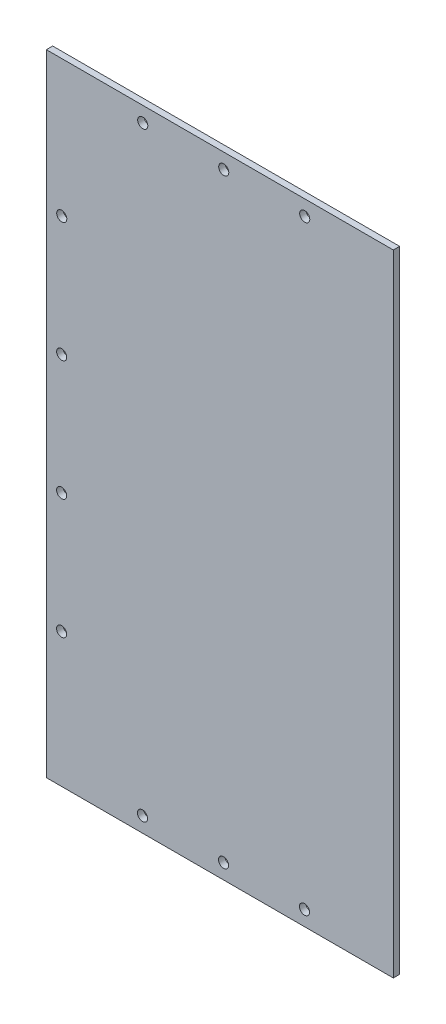
ISO-10303-21;
HEADER;
FILE_DESCRIPTION(('STEP AP214'),'2;1');
FILE_NAME('part.step','',(''),(''),'','','');
FILE_SCHEMA(('AUTOMOTIVE_DESIGN { 1 0 10303 214 1 1 1 1 }'));
ENDSEC;
DATA;
#1=APPLICATION_CONTEXT('core data for automotive mechanical design processes');
#2=APPLICATION_PROTOCOL_DEFINITION('international standard','automotive_design',2000,#1);
#3=PRODUCT_CONTEXT('',#1,'mechanical');
#4=PRODUCT('Part','Part','',(#3));
#5=PRODUCT_RELATED_PRODUCT_CATEGORY('part','',(#4));
#6=PRODUCT_DEFINITION_FORMATION('','',#4);
#7=PRODUCT_DEFINITION_CONTEXT('part definition',#1,'design');
#8=PRODUCT_DEFINITION('design','',#6,#7);
#9=PRODUCT_DEFINITION_SHAPE('','',#8);
#10=(LENGTH_UNIT() NAMED_UNIT(*) SI_UNIT(.MILLI.,.METRE.));
#11=(NAMED_UNIT(*) PLANE_ANGLE_UNIT() SI_UNIT($,.RADIAN.));
#12=(NAMED_UNIT(*) SI_UNIT($,.STERADIAN.) SOLID_ANGLE_UNIT());
#13=UNCERTAINTY_MEASURE_WITH_UNIT(LENGTH_MEASURE(1.E-05),#10,'distance_accuracy_value','');
#14=(GEOMETRIC_REPRESENTATION_CONTEXT(3) GLOBAL_UNCERTAINTY_ASSIGNED_CONTEXT((#13)) GLOBAL_UNIT_ASSIGNED_CONTEXT((#10,
#11,#12)) REPRESENTATION_CONTEXT('',''));
#15=CARTESIAN_POINT('',(0.,0.,0.));
#16=DIRECTION('',(0.,0.,1.));
#17=DIRECTION('',(1.,0.,0.));
#18=AXIS2_PLACEMENT_3D('',#15,#16,#17);
#19=CARTESIAN_POINT('',(-228.841848041994,-444.850958250123,5.));
#20=DIRECTION('',(1.,0.,0.));
#21=DIRECTION('',(0.,0.,-1.));
#22=AXIS2_PLACEMENT_3D('',#19,#20,#21);
#23=PLANE('',#22);
#24=DIRECTION('',(0.,-1.,0.));
#25=VECTOR('',#24,1.);
#26=CARTESIAN_POINT('',(-228.841848041994,-444.850958250123,0.));
#27=LINE('',#26,#25);
#28=CARTESIAN_POINT('',(-228.841848041994,53.4962366274568,0.));
#29=VERTEX_POINT('',#28);
#30=CARTESIAN_POINT('',(-228.841848041994,-444.850958250123,0.));
#31=VERTEX_POINT('',#30);
#32=EDGE_CURVE('E99',#29,#31,#27,.T.);
#33=ORIENTED_EDGE('',*,*,#32,.T.);
#34=DIRECTION('',(0.,0.,-1.));
#35=VECTOR('',#34,1.);
#36=CARTESIAN_POINT('',(-228.841848041994,-444.850958250123,5.));
#37=LINE('',#36,#35);
#38=CARTESIAN_POINT('',(-228.841848041994,-444.850958250123,5.));
#39=VERTEX_POINT('',#38);
#40=EDGE_CURVE('E11',#39,#31,#37,.T.);
#41=ORIENTED_EDGE('',*,*,#40,.F.);
#42=DIRECTION('',(0.,-1.,0.));
#43=VECTOR('',#42,1.);
#44=CARTESIAN_POINT('',(-228.841848041994,-444.850958250123,5.));
#45=LINE('',#44,#43);
#46=CARTESIAN_POINT('',(-228.841848041994,53.4962366274568,5.));
#47=VERTEX_POINT('',#46);
#48=EDGE_CURVE('E87',#47,#39,#45,.T.);
#49=ORIENTED_EDGE('',*,*,#48,.F.);
#50=DIRECTION('',(0.,0.,-1.));
#51=VECTOR('',#50,1.);
#52=CARTESIAN_POINT('',(-228.841848041994,53.4962366274568,5.));
#53=LINE('',#52,#51);
#54=EDGE_CURVE('E95',#47,#29,#53,.T.);
#55=ORIENTED_EDGE('',*,*,#54,.T.);
#56=EDGE_LOOP('',(#33,#41,#49,#55));
#57=FACE_BOUND('',#56,.T.);
#58=ADVANCED_FACE('F36',(#57),#23,.F.);
#59=CARTESIAN_POINT('',(-228.841848041994,-444.850958250123,5.));
#60=DIRECTION('',(0.,1.,0.));
#61=DIRECTION('',(0.,0.,1.));
#62=AXIS2_PLACEMENT_3D('',#59,#60,#61);
#63=PLANE('',#62);
#64=DIRECTION('',(1.,0.,0.));
#65=VECTOR('',#64,1.);
#66=CARTESIAN_POINT('',(-228.841848041994,-444.850958250123,0.));
#67=LINE('',#66,#65);
#68=CARTESIAN_POINT('',(45.421551958008,-444.850958250123,0.));
#69=VERTEX_POINT('',#68);
#70=EDGE_CURVE('E91',#31,#69,#67,.T.);
#71=ORIENTED_EDGE('',*,*,#70,.T.);
#72=DIRECTION('',(0.,0.,-1.));
#73=VECTOR('',#72,1.);
#74=CARTESIAN_POINT('',(45.421551958008,-444.850958250123,5.));
#75=LINE('',#74,#73);
#76=CARTESIAN_POINT('',(45.421551958008,-444.850958250123,5.));
#77=VERTEX_POINT('',#76);
#78=EDGE_CURVE('E44',#77,#69,#75,.T.);
#79=ORIENTED_EDGE('',*,*,#78,.F.);
#80=DIRECTION('',(1.,0.,0.));
#81=VECTOR('',#80,1.);
#82=CARTESIAN_POINT('',(-228.841848041994,-444.850958250123,5.));
#83=LINE('',#82,#81);
#84=EDGE_CURVE('E82',#39,#77,#83,.T.);
#85=ORIENTED_EDGE('',*,*,#84,.F.);
#86=ORIENTED_EDGE('',*,*,#40,.T.);
#87=EDGE_LOOP('',(#71,#79,#85,#86));
#88=FACE_BOUND('',#87,.T.);
#89=ADVANCED_FACE('F90',(#88),#63,.F.);
#90=CARTESIAN_POINT('',(45.4215519580079,53.4962366274568,5.));
#91=DIRECTION('',(-1.,0.,0.));
#92=DIRECTION('',(0.,-1.,0.));
#93=AXIS2_PLACEMENT_3D('',#90,#91,#92);
#94=PLANE('',#93);
#95=DIRECTION('',(0.,1.,0.));
#96=VECTOR('',#95,1.);
#97=CARTESIAN_POINT('',(45.4215519580079,53.4962366274568,0.));
#98=LINE('',#97,#96);
#99=CARTESIAN_POINT('',(45.4215519580079,53.4962366274568,0.));
#100=VERTEX_POINT('',#99);
#101=EDGE_CURVE('E69',#69,#100,#98,.T.);
#102=ORIENTED_EDGE('',*,*,#101,.T.);
#103=DIRECTION('',(0.,0.,-1.));
#104=VECTOR('',#103,1.);
#105=CARTESIAN_POINT('',(45.4215519580079,53.4962366274568,5.));
#106=LINE('',#105,#104);
#107=CARTESIAN_POINT('',(45.4215519580079,53.4962366274568,5.));
#108=VERTEX_POINT('',#107);
#109=EDGE_CURVE('E92',#108,#100,#106,.T.);
#110=ORIENTED_EDGE('',*,*,#109,.F.);
#111=DIRECTION('',(0.,1.,0.));
#112=VECTOR('',#111,1.);
#113=CARTESIAN_POINT('',(45.4215519580079,53.4962366274568,5.));
#114=LINE('',#113,#112);
#115=EDGE_CURVE('E85',#77,#108,#114,.T.);
#116=ORIENTED_EDGE('',*,*,#115,.F.);
#117=ORIENTED_EDGE('',*,*,#78,.T.);
#118=EDGE_LOOP('',(#102,#110,#116,#117));
#119=FACE_BOUND('',#118,.T.);
#120=ADVANCED_FACE('F93',(#119),#94,.F.);
#121=CARTESIAN_POINT('',(-228.841848041994,53.4962366274568,5.));
#122=DIRECTION('',(0.,-1.,0.));
#123=DIRECTION('',(1.,0.,0.));
#124=AXIS2_PLACEMENT_3D('',#121,#122,#123);
#125=PLANE('',#124);
#126=DIRECTION('',(-1.,0.,0.));
#127=VECTOR('',#126,1.);
#128=CARTESIAN_POINT('',(-228.841848041994,53.4962366274568,0.));
#129=LINE('',#128,#127);
#130=EDGE_CURVE('E75',#100,#29,#129,.T.);
#131=ORIENTED_EDGE('',*,*,#130,.T.);
#132=ORIENTED_EDGE('',*,*,#54,.F.);
#133=DIRECTION('',(-1.,0.,0.));
#134=VECTOR('',#133,1.);
#135=CARTESIAN_POINT('',(-228.841848041994,53.4962366274568,5.));
#136=LINE('',#135,#134);
#137=EDGE_CURVE('E52',#108,#47,#136,.T.);
#138=ORIENTED_EDGE('',*,*,#137,.F.);
#139=ORIENTED_EDGE('',*,*,#109,.T.);
#140=EDGE_LOOP('',(#131,#132,#138,#139));
#141=FACE_BOUND('',#140,.T.);
#142=ADVANCED_FACE('F107',(#141),#125,.F.);
#143=CARTESIAN_POINT('',(0.,0.,5.));
#144=DIRECTION('',(0.,0.,-1.));
#145=DIRECTION('',(-1.,0.,0.));
#146=AXIS2_PLACEMENT_3D('',#143,#144,#145);
#147=PLANE('',#146);
#148=CARTESIAN_POINT('',(-88.6292429195729,41.4712366274558,5.));
#149=DIRECTION('',(0.,0.,-1.));
#150=DIRECTION('',(-1.,0.,0.));
#151=AXIS2_PLACEMENT_3D('',#148,#149,#150);
#152=CIRCLE('',#151,3.99999999999999);
#153=CARTESIAN_POINT('',(-92.6292429195729,41.4712366274558,5.));
#154=VERTEX_POINT('',#153);
#155=EDGE_CURVE('E118',#154,#154,#152,.F.);
#156=ORIENTED_EDGE('',*,*,#155,.F.);
#157=EDGE_LOOP('',(#156));
#158=FACE_BOUND('',#157,.T.);
#159=CARTESIAN_POINT('',(-24.6212429195729,41.4712366274558,5.));
#160=DIRECTION('',(0.,0.,-1.));
#161=DIRECTION('',(-1.,0.,0.));
#162=AXIS2_PLACEMENT_3D('',#159,#160,#161);
#163=CIRCLE('',#162,4.00000000000001);
#164=CARTESIAN_POINT('',(-28.6212429195729,41.4712366274558,5.));
#165=VERTEX_POINT('',#164);
#166=EDGE_CURVE('E157',#165,#165,#163,.F.);
#167=ORIENTED_EDGE('',*,*,#166,.F.);
#168=EDGE_LOOP('',(#167));
#169=FACE_BOUND('',#168,.T.);
#170=CARTESIAN_POINT('',(-216.673520112257,-54.3287633725442,5.));
#171=DIRECTION('',(0.,0.,-1.));
#172=DIRECTION('',(-1.,0.,0.));
#173=AXIS2_PLACEMENT_3D('',#170,#171,#172);
#174=CIRCLE('',#173,4.00000000000002);
#175=CARTESIAN_POINT('',(-220.673520112257,-54.3287633725442,5.));
#176=VERTEX_POINT('',#175);
#177=EDGE_CURVE('E151',#176,#176,#174,.F.);
#178=ORIENTED_EDGE('',*,*,#177,.F.);
#179=EDGE_LOOP('',(#178));
#180=FACE_BOUND('',#179,.T.);
#181=CARTESIAN_POINT('',(-216.70939666538,-149.070763372544,5.));
#182=DIRECTION('',(0.,0.,-1.));
#183=DIRECTION('',(-1.,0.,0.));
#184=AXIS2_PLACEMENT_3D('',#181,#182,#183);
#185=CIRCLE('',#184,3.99999999999999);
#186=CARTESIAN_POINT('',(-220.70939666538,-149.070763372544,5.));
#187=VERTEX_POINT('',#186);
#188=EDGE_CURVE('E145',#187,#187,#185,.F.);
#189=ORIENTED_EDGE('',*,*,#188,.F.);
#190=EDGE_LOOP('',(#189));
#191=FACE_BOUND('',#190,.T.);
#192=CARTESIAN_POINT('',(-216.745295181731,-243.870763372544,5.));
#193=DIRECTION('',(0.,0.,-1.));
#194=DIRECTION('',(-1.,0.,0.));
#195=AXIS2_PLACEMENT_3D('',#192,#193,#194);
#196=CIRCLE('',#195,3.99999999999999);
#197=CARTESIAN_POINT('',(-220.745295181731,-243.870763372544,5.));
#198=VERTEX_POINT('',#197);
#199=EDGE_CURVE('E139',#198,#198,#196,.F.);
#200=ORIENTED_EDGE('',*,*,#199,.F.);
#201=EDGE_LOOP('',(#200));
#202=FACE_BOUND('',#201,.T.);
#203=CARTESIAN_POINT('',(-216.781193698083,-338.670763372544,5.));
#204=DIRECTION('',(0.,0.,-1.));
#205=DIRECTION('',(-1.,0.,0.));
#206=AXIS2_PLACEMENT_3D('',#203,#204,#205);
#207=CIRCLE('',#206,4.00000000000002);
#208=CARTESIAN_POINT('',(-220.781193698083,-338.670763372544,5.));
#209=VERTEX_POINT('',#208);
#210=EDGE_CURVE('E133',#209,#209,#207,.F.);
#211=ORIENTED_EDGE('',*,*,#210,.F.);
#212=EDGE_LOOP('',(#211));
#213=FACE_BOUND('',#212,.T.);
#214=CARTESIAN_POINT('',(-152.808848041994,-432.870680177189,5.));
#215=DIRECTION('',(0.,0.,-1.));
#216=DIRECTION('',(-1.,0.,0.));
#217=AXIS2_PLACEMENT_3D('',#214,#215,#216);
#218=CIRCLE('',#217,3.99999999999999);
#219=CARTESIAN_POINT('',(-156.808848041994,-432.870680177189,5.));
#220=VERTEX_POINT('',#219);
#221=EDGE_CURVE('E127',#220,#220,#218,.F.);
#222=ORIENTED_EDGE('',*,*,#221,.F.);
#223=EDGE_LOOP('',(#222));
#224=FACE_BOUND('',#223,.T.);
#225=CARTESIAN_POINT('',(-88.8008480419944,-432.915402104254,5.));
#226=DIRECTION('',(0.,0.,-1.));
#227=DIRECTION('',(-1.,0.,0.));
#228=AXIS2_PLACEMENT_3D('',#225,#226,#227);
#229=CIRCLE('',#228,4.00000000000003);
#230=CARTESIAN_POINT('',(-92.8008480419944,-432.915402104254,5.));
#231=VERTEX_POINT('',#230);
#232=EDGE_CURVE('E119',#231,#231,#229,.F.);
#233=ORIENTED_EDGE('',*,*,#232,.F.);
#234=EDGE_LOOP('',(#233));
#235=FACE_BOUND('',#234,.T.);
#236=CARTESIAN_POINT('',(-24.7928480419944,-432.960124031319,5.));
#237=DIRECTION('',(0.,0.,-1.));
#238=DIRECTION('',(-1.,0.,0.));
#239=AXIS2_PLACEMENT_3D('',#236,#237,#238);
#240=CIRCLE('',#239,3.99999999999999);
#241=CARTESIAN_POINT('',(-28.7928480419944,-432.960124031319,5.));
#242=VERTEX_POINT('',#241);
#243=EDGE_CURVE('E126',#242,#242,#240,.F.);
#244=ORIENTED_EDGE('',*,*,#243,.F.);
#245=EDGE_LOOP('',(#244));
#246=FACE_BOUND('',#245,.T.);
#247=CARTESIAN_POINT('',(-152.637242919573,41.4712366274558,5.));
#248=DIRECTION('',(0.,0.,-1.));
#249=DIRECTION('',(-1.,0.,0.));
#250=AXIS2_PLACEMENT_3D('',#247,#248,#249);
#251=CIRCLE('',#250,3.99999999999999);
#252=CARTESIAN_POINT('',(-156.637242919573,41.4712366274558,5.));
#253=VERTEX_POINT('',#252);
#254=EDGE_CURVE('E102',#253,#253,#251,.F.);
#255=ORIENTED_EDGE('',*,*,#254,.F.);
#256=EDGE_LOOP('',(#255));
#257=FACE_BOUND('',#256,.T.);
#258=ORIENTED_EDGE('',*,*,#48,.T.);
#259=ORIENTED_EDGE('',*,*,#84,.T.);
#260=ORIENTED_EDGE('',*,*,#115,.T.);
#261=ORIENTED_EDGE('',*,*,#137,.T.);
#262=EDGE_LOOP('',(#258,#259,#260,#261));
#263=FACE_BOUND('',#262,.T.);
#264=ADVANCED_FACE('F83',(#158,#169,#180,#191,#202,#213,#224,#235,#246,#257,#263),#147,.F.);
#265=CARTESIAN_POINT('',(0.,0.,0.));
#266=DIRECTION('',(0.,0.,-1.));
#267=DIRECTION('',(-1.,0.,0.));
#268=AXIS2_PLACEMENT_3D('',#265,#266,#267);
#269=PLANE('',#268);
#270=CARTESIAN_POINT('',(-88.6292429195729,41.4712366274558,0.));
#271=DIRECTION('',(0.,0.,-1.));
#272=DIRECTION('',(-1.,0.,0.));
#273=AXIS2_PLACEMENT_3D('',#270,#271,#272);
#274=CIRCLE('',#273,3.99999999999999);
#275=CARTESIAN_POINT('',(-92.6292429195729,41.4712366274558,0.));
#276=VERTEX_POINT('',#275);
#277=EDGE_CURVE('E160',#276,#276,#274,.T.);
#278=ORIENTED_EDGE('',*,*,#277,.F.);
#279=EDGE_LOOP('',(#278));
#280=FACE_BOUND('',#279,.T.);
#281=CARTESIAN_POINT('',(-24.6212429195729,41.4712366274558,0.));
#282=DIRECTION('',(0.,0.,-1.));
#283=DIRECTION('',(-1.,0.,0.));
#284=AXIS2_PLACEMENT_3D('',#281,#282,#283);
#285=CIRCLE('',#284,4.00000000000001);
#286=CARTESIAN_POINT('',(-28.6212429195729,41.4712366274558,0.));
#287=VERTEX_POINT('',#286);
#288=EDGE_CURVE('E154',#287,#287,#285,.T.);
#289=ORIENTED_EDGE('',*,*,#288,.F.);
#290=EDGE_LOOP('',(#289));
#291=FACE_BOUND('',#290,.T.);
#292=CARTESIAN_POINT('',(-216.673520112257,-54.3287633725442,0.));
#293=DIRECTION('',(0.,0.,-1.));
#294=DIRECTION('',(-1.,0.,0.));
#295=AXIS2_PLACEMENT_3D('',#292,#293,#294);
#296=CIRCLE('',#295,4.00000000000002);
#297=CARTESIAN_POINT('',(-220.673520112257,-54.3287633725442,0.));
#298=VERTEX_POINT('',#297);
#299=EDGE_CURVE('E148',#298,#298,#296,.T.);
#300=ORIENTED_EDGE('',*,*,#299,.F.);
#301=EDGE_LOOP('',(#300));
#302=FACE_BOUND('',#301,.T.);
#303=CARTESIAN_POINT('',(-216.70939666538,-149.070763372544,0.));
#304=DIRECTION('',(0.,0.,-1.));
#305=DIRECTION('',(-1.,0.,0.));
#306=AXIS2_PLACEMENT_3D('',#303,#304,#305);
#307=CIRCLE('',#306,3.99999999999999);
#308=CARTESIAN_POINT('',(-220.70939666538,-149.070763372544,0.));
#309=VERTEX_POINT('',#308);
#310=EDGE_CURVE('E142',#309,#309,#307,.T.);
#311=ORIENTED_EDGE('',*,*,#310,.F.);
#312=EDGE_LOOP('',(#311));
#313=FACE_BOUND('',#312,.T.);
#314=CARTESIAN_POINT('',(-216.745295181731,-243.870763372544,0.));
#315=DIRECTION('',(0.,0.,-1.));
#316=DIRECTION('',(-1.,0.,0.));
#317=AXIS2_PLACEMENT_3D('',#314,#315,#316);
#318=CIRCLE('',#317,3.99999999999999);
#319=CARTESIAN_POINT('',(-220.745295181731,-243.870763372544,0.));
#320=VERTEX_POINT('',#319);
#321=EDGE_CURVE('E136',#320,#320,#318,.T.);
#322=ORIENTED_EDGE('',*,*,#321,.F.);
#323=EDGE_LOOP('',(#322));
#324=FACE_BOUND('',#323,.T.);
#325=CARTESIAN_POINT('',(-216.781193698083,-338.670763372544,0.));
#326=DIRECTION('',(0.,0.,-1.));
#327=DIRECTION('',(-1.,0.,0.));
#328=AXIS2_PLACEMENT_3D('',#325,#326,#327);
#329=CIRCLE('',#328,4.00000000000002);
#330=CARTESIAN_POINT('',(-220.781193698083,-338.670763372544,0.));
#331=VERTEX_POINT('',#330);
#332=EDGE_CURVE('E130',#331,#331,#329,.T.);
#333=ORIENTED_EDGE('',*,*,#332,.F.);
#334=EDGE_LOOP('',(#333));
#335=FACE_BOUND('',#334,.T.);
#336=CARTESIAN_POINT('',(-152.808848041994,-432.870680177189,0.));
#337=DIRECTION('',(0.,0.,-1.));
#338=DIRECTION('',(-1.,0.,0.));
#339=AXIS2_PLACEMENT_3D('',#336,#337,#338);
#340=CIRCLE('',#339,3.99999999999999);
#341=CARTESIAN_POINT('',(-156.808848041994,-432.870680177189,0.));
#342=VERTEX_POINT('',#341);
#343=EDGE_CURVE('E122',#342,#342,#340,.T.);
#344=ORIENTED_EDGE('',*,*,#343,.F.);
#345=EDGE_LOOP('',(#344));
#346=FACE_BOUND('',#345,.T.);
#347=CARTESIAN_POINT('',(-88.8008480419944,-432.915402104254,0.));
#348=DIRECTION('',(0.,0.,-1.));
#349=DIRECTION('',(-1.,0.,0.));
#350=AXIS2_PLACEMENT_3D('',#347,#348,#349);
#351=CIRCLE('',#350,4.00000000000003);
#352=CARTESIAN_POINT('',(-92.8008480419944,-432.915402104254,0.));
#353=VERTEX_POINT('',#352);
#354=EDGE_CURVE('E123',#353,#353,#351,.T.);
#355=ORIENTED_EDGE('',*,*,#354,.F.);
#356=EDGE_LOOP('',(#355));
#357=FACE_BOUND('',#356,.T.);
#358=CARTESIAN_POINT('',(-24.7928480419944,-432.960124031319,0.));
#359=DIRECTION('',(0.,0.,-1.));
#360=DIRECTION('',(-1.,0.,0.));
#361=AXIS2_PLACEMENT_3D('',#358,#359,#360);
#362=CIRCLE('',#361,3.99999999999999);
#363=CARTESIAN_POINT('',(-28.7928480419944,-432.960124031319,0.));
#364=VERTEX_POINT('',#363);
#365=EDGE_CURVE('E169',#364,#364,#362,.T.);
#366=ORIENTED_EDGE('',*,*,#365,.F.);
#367=EDGE_LOOP('',(#366));
#368=FACE_BOUND('',#367,.T.);
#369=CARTESIAN_POINT('',(-152.637242919573,41.4712366274558,0.));
#370=DIRECTION('',(0.,0.,-1.));
#371=DIRECTION('',(-1.,0.,0.));
#372=AXIS2_PLACEMENT_3D('',#369,#370,#371);
#373=CIRCLE('',#372,3.99999999999999);
#374=CARTESIAN_POINT('',(-156.637242919573,41.4712366274558,0.));
#375=VERTEX_POINT('',#374);
#376=EDGE_CURVE('E115',#375,#375,#373,.T.);
#377=ORIENTED_EDGE('',*,*,#376,.F.);
#378=EDGE_LOOP('',(#377));
#379=FACE_BOUND('',#378,.T.);
#380=ORIENTED_EDGE('',*,*,#32,.F.);
#381=ORIENTED_EDGE('',*,*,#130,.F.);
#382=ORIENTED_EDGE('',*,*,#101,.F.);
#383=ORIENTED_EDGE('',*,*,#70,.F.);
#384=EDGE_LOOP('',(#380,#381,#382,#383));
#385=FACE_BOUND('',#384,.T.);
#386=ADVANCED_FACE('F110',(#280,#291,#302,#313,#324,#335,#346,#357,#368,#379,#385),#269,.T.);
#387=CARTESIAN_POINT('',(-152.637242919573,41.4712366274558,5.001));
#388=DIRECTION('',(0.,0.,-1.));
#389=DIRECTION('',(-1.,0.,0.));
#390=AXIS2_PLACEMENT_3D('',#387,#388,#389);
#391=CYLINDRICAL_SURFACE('',#390,3.99999999999999);
#392=ORIENTED_EDGE('',*,*,#376,.T.);
#393=EDGE_LOOP('',(#392));
#394=FACE_BOUND('',#393,.T.);
#395=ORIENTED_EDGE('',*,*,#254,.T.);
#396=EDGE_LOOP('',(#395));
#397=FACE_BOUND('',#396,.T.);
#398=ADVANCED_FACE('F178',(#394,#397),#391,.F.);
#399=CARTESIAN_POINT('',(-24.7928480419944,-432.960124031319,5.001));
#400=DIRECTION('',(0.,0.,-1.));
#401=DIRECTION('',(-1.,0.,0.));
#402=AXIS2_PLACEMENT_3D('',#399,#400,#401);
#403=CYLINDRICAL_SURFACE('',#402,3.99999999999999);
#404=ORIENTED_EDGE('',*,*,#365,.T.);
#405=EDGE_LOOP('',(#404));
#406=FACE_BOUND('',#405,.T.);
#407=ORIENTED_EDGE('',*,*,#243,.T.);
#408=EDGE_LOOP('',(#407));
#409=FACE_BOUND('',#408,.T.);
#410=ADVANCED_FACE('F173',(#406,#409),#403,.F.);
#411=CARTESIAN_POINT('',(-88.8008480419944,-432.915402104254,5.001));
#412=DIRECTION('',(0.,0.,-1.));
#413=DIRECTION('',(-1.,0.,0.));
#414=AXIS2_PLACEMENT_3D('',#411,#412,#413);
#415=CYLINDRICAL_SURFACE('',#414,4.00000000000003);
#416=ORIENTED_EDGE('',*,*,#354,.T.);
#417=EDGE_LOOP('',(#416));
#418=FACE_BOUND('',#417,.T.);
#419=ORIENTED_EDGE('',*,*,#232,.T.);
#420=EDGE_LOOP('',(#419));
#421=FACE_BOUND('',#420,.T.);
#422=ADVANCED_FACE('F240',(#418,#421),#415,.F.);
#423=CARTESIAN_POINT('',(-152.808848041994,-432.870680177189,5.001));
#424=DIRECTION('',(0.,0.,-1.));
#425=DIRECTION('',(-1.,0.,0.));
#426=AXIS2_PLACEMENT_3D('',#423,#424,#425);
#427=CYLINDRICAL_SURFACE('',#426,3.99999999999999);
#428=ORIENTED_EDGE('',*,*,#343,.T.);
#429=EDGE_LOOP('',(#428));
#430=FACE_BOUND('',#429,.T.);
#431=ORIENTED_EDGE('',*,*,#221,.T.);
#432=EDGE_LOOP('',(#431));
#433=FACE_BOUND('',#432,.T.);
#434=ADVANCED_FACE('F250',(#430,#433),#427,.F.);
#435=CARTESIAN_POINT('',(-216.781193698083,-338.670763372544,5.001));
#436=DIRECTION('',(0.,0.,-1.));
#437=DIRECTION('',(-1.,0.,0.));
#438=AXIS2_PLACEMENT_3D('',#435,#436,#437);
#439=CYLINDRICAL_SURFACE('',#438,4.00000000000002);
#440=ORIENTED_EDGE('',*,*,#332,.T.);
#441=EDGE_LOOP('',(#440));
#442=FACE_BOUND('',#441,.T.);
#443=ORIENTED_EDGE('',*,*,#210,.T.);
#444=EDGE_LOOP('',(#443));
#445=FACE_BOUND('',#444,.T.);
#446=ADVANCED_FACE('F261',(#442,#445),#439,.F.);
#447=CARTESIAN_POINT('',(-216.745295181731,-243.870763372544,5.001));
#448=DIRECTION('',(0.,0.,-1.));
#449=DIRECTION('',(-1.,0.,0.));
#450=AXIS2_PLACEMENT_3D('',#447,#448,#449);
#451=CYLINDRICAL_SURFACE('',#450,3.99999999999999);
#452=ORIENTED_EDGE('',*,*,#321,.T.);
#453=EDGE_LOOP('',(#452));
#454=FACE_BOUND('',#453,.T.);
#455=ORIENTED_EDGE('',*,*,#199,.T.);
#456=EDGE_LOOP('',(#455));
#457=FACE_BOUND('',#456,.T.);
#458=ADVANCED_FACE('F272',(#454,#457),#451,.F.);
#459=CARTESIAN_POINT('',(-216.70939666538,-149.070763372544,5.001));
#460=DIRECTION('',(0.,0.,-1.));
#461=DIRECTION('',(-1.,0.,0.));
#462=AXIS2_PLACEMENT_3D('',#459,#460,#461);
#463=CYLINDRICAL_SURFACE('',#462,3.99999999999999);
#464=ORIENTED_EDGE('',*,*,#310,.T.);
#465=EDGE_LOOP('',(#464));
#466=FACE_BOUND('',#465,.T.);
#467=ORIENTED_EDGE('',*,*,#188,.T.);
#468=EDGE_LOOP('',(#467));
#469=FACE_BOUND('',#468,.T.);
#470=ADVANCED_FACE('F283',(#466,#469),#463,.F.);
#471=CARTESIAN_POINT('',(-216.673520112257,-54.3287633725442,5.001));
#472=DIRECTION('',(0.,0.,-1.));
#473=DIRECTION('',(-1.,0.,0.));
#474=AXIS2_PLACEMENT_3D('',#471,#472,#473);
#475=CYLINDRICAL_SURFACE('',#474,4.00000000000002);
#476=ORIENTED_EDGE('',*,*,#299,.T.);
#477=EDGE_LOOP('',(#476));
#478=FACE_BOUND('',#477,.T.);
#479=ORIENTED_EDGE('',*,*,#177,.T.);
#480=EDGE_LOOP('',(#479));
#481=FACE_BOUND('',#480,.T.);
#482=ADVANCED_FACE('F294',(#478,#481),#475,.F.);
#483=CARTESIAN_POINT('',(-24.6212429195729,41.4712366274558,5.001));
#484=DIRECTION('',(0.,0.,-1.));
#485=DIRECTION('',(-1.,0.,0.));
#486=AXIS2_PLACEMENT_3D('',#483,#484,#485);
#487=CYLINDRICAL_SURFACE('',#486,4.00000000000001);
#488=ORIENTED_EDGE('',*,*,#288,.T.);
#489=EDGE_LOOP('',(#488));
#490=FACE_BOUND('',#489,.T.);
#491=ORIENTED_EDGE('',*,*,#166,.T.);
#492=EDGE_LOOP('',(#491));
#493=FACE_BOUND('',#492,.T.);
#494=ADVANCED_FACE('F305',(#490,#493),#487,.F.);
#495=CARTESIAN_POINT('',(-88.6292429195729,41.4712366274558,5.001));
#496=DIRECTION('',(0.,0.,-1.));
#497=DIRECTION('',(-1.,0.,0.));
#498=AXIS2_PLACEMENT_3D('',#495,#496,#497);
#499=CYLINDRICAL_SURFACE('',#498,3.99999999999999);
#500=ORIENTED_EDGE('',*,*,#277,.T.);
#501=EDGE_LOOP('',(#500));
#502=FACE_BOUND('',#501,.T.);
#503=ORIENTED_EDGE('',*,*,#155,.T.);
#504=EDGE_LOOP('',(#503));
#505=FACE_BOUND('',#504,.T.);
#506=ADVANCED_FACE('F316',(#502,#505),#499,.F.);
#507=CLOSED_SHELL('',(#58,#89,#120,#142,#264,#386,#398,#410,#422,#434,#446,#458,#470,#482,#494,#506));
#508=MANIFOLD_SOLID_BREP('B2',#507);
#509=ADVANCED_BREP_SHAPE_REPRESENTATION('',(#18,#508),#14);
#510=SHAPE_DEFINITION_REPRESENTATION(#9,#509);
ENDSEC;
END-ISO-10303-21;
